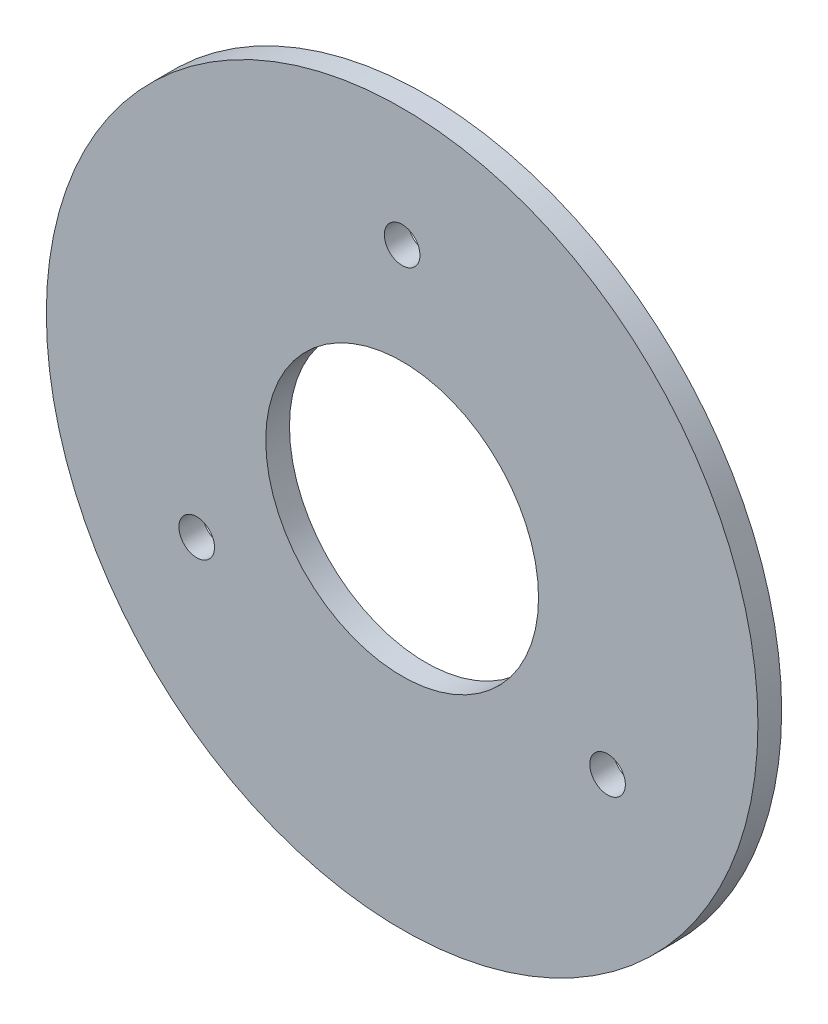
ISO-10303-21;
HEADER;
FILE_DESCRIPTION(('STEP AP214'),'2;1');
FILE_NAME('part.step','',(''),(''),'','','');
FILE_SCHEMA(('AUTOMOTIVE_DESIGN { 1 0 10303 214 1 1 1 1 }'));
ENDSEC;
DATA;
#1=APPLICATION_CONTEXT('core data for automotive mechanical design processes');
#2=APPLICATION_PROTOCOL_DEFINITION('international standard','automotive_design',2000,#1);
#3=PRODUCT_CONTEXT('',#1,'mechanical');
#4=PRODUCT('Part','Part','',(#3));
#5=PRODUCT_RELATED_PRODUCT_CATEGORY('part','',(#4));
#6=PRODUCT_DEFINITION_FORMATION('','',#4);
#7=PRODUCT_DEFINITION_CONTEXT('part definition',#1,'design');
#8=PRODUCT_DEFINITION('design','',#6,#7);
#9=PRODUCT_DEFINITION_SHAPE('','',#8);
#10=(LENGTH_UNIT() NAMED_UNIT(*) SI_UNIT(.MILLI.,.METRE.));
#11=(NAMED_UNIT(*) PLANE_ANGLE_UNIT() SI_UNIT($,.RADIAN.));
#12=(NAMED_UNIT(*) SI_UNIT($,.STERADIAN.) SOLID_ANGLE_UNIT());
#13=UNCERTAINTY_MEASURE_WITH_UNIT(LENGTH_MEASURE(1.E-05),#10,'distance_accuracy_value','');
#14=(GEOMETRIC_REPRESENTATION_CONTEXT(3) GLOBAL_UNCERTAINTY_ASSIGNED_CONTEXT((#13)) GLOBAL_UNIT_ASSIGNED_CONTEXT((#10,
#11,#12)) REPRESENTATION_CONTEXT('',''));
#15=CARTESIAN_POINT('',(0.,0.,0.));
#16=DIRECTION('',(0.,0.,1.));
#17=DIRECTION('',(1.,0.,0.));
#18=AXIS2_PLACEMENT_3D('',#15,#16,#17);
#19=CARTESIAN_POINT('',(0.,0.,2.));
#20=DIRECTION('',(0.,0.,1.));
#21=DIRECTION('',(1.,0.,0.));
#22=AXIS2_PLACEMENT_3D('',#19,#20,#21);
#23=PLANE('',#22);
#24=CARTESIAN_POINT('',(17.3205080756888,-10.,2.));
#25=DIRECTION('',(0.,0.,1.));
#26=DIRECTION('',(1.,0.,0.));
#27=AXIS2_PLACEMENT_3D('',#24,#25,#26);
#28=CIRCLE('',#27,1.5);
#29=CARTESIAN_POINT('',(18.8205080756888,-10.,2.));
#30=VERTEX_POINT('',#29);
#31=EDGE_CURVE('E61',#30,#30,#28,.T.);
#32=ORIENTED_EDGE('',*,*,#31,.F.);
#33=EDGE_LOOP('',(#32));
#34=FACE_BOUND('',#33,.T.);
#35=CARTESIAN_POINT('',(0.,0.,2.));
#36=DIRECTION('',(0.,0.,1.));
#37=DIRECTION('',(1.,0.,0.));
#38=AXIS2_PLACEMENT_3D('',#35,#36,#37);
#39=CIRCLE('',#38,11.5);
#40=CARTESIAN_POINT('',(11.5,0.,2.));
#41=VERTEX_POINT('',#40);
#42=EDGE_CURVE('E49',#41,#41,#39,.T.);
#43=ORIENTED_EDGE('',*,*,#42,.F.);
#44=EDGE_LOOP('',(#43));
#45=FACE_BOUND('',#44,.T.);
#46=CARTESIAN_POINT('',(0.,0.,2.));
#47=DIRECTION('',(0.,0.,1.));
#48=DIRECTION('',(1.,0.,0.));
#49=AXIS2_PLACEMENT_3D('',#46,#47,#48);
#50=CIRCLE('',#49,30.);
#51=CARTESIAN_POINT('',(30.,0.,2.));
#52=VERTEX_POINT('',#51);
#53=EDGE_CURVE('E10',#52,#52,#50,.T.);
#54=ORIENTED_EDGE('',*,*,#53,.T.);
#55=EDGE_LOOP('',(#54));
#56=FACE_BOUND('',#55,.T.);
#57=CARTESIAN_POINT('',(0.,20.,2.));
#58=DIRECTION('',(0.,0.,1.));
#59=DIRECTION('',(1.,0.,0.));
#60=AXIS2_PLACEMENT_3D('',#57,#58,#59);
#61=CIRCLE('',#60,1.5);
#62=CARTESIAN_POINT('',(1.5,20.,2.));
#63=VERTEX_POINT('',#62);
#64=EDGE_CURVE('E54',#63,#63,#61,.T.);
#65=ORIENTED_EDGE('',*,*,#64,.F.);
#66=EDGE_LOOP('',(#65));
#67=FACE_BOUND('',#66,.T.);
#68=CARTESIAN_POINT('',(-17.3205080756888,-10.,2.));
#69=DIRECTION('',(0.,0.,1.));
#70=DIRECTION('',(1.,0.,0.));
#71=AXIS2_PLACEMENT_3D('',#68,#69,#70);
#72=CIRCLE('',#71,1.5);
#73=CARTESIAN_POINT('',(-15.8205080756888,-10.,2.));
#74=VERTEX_POINT('',#73);
#75=EDGE_CURVE('E69',#74,#74,#72,.T.);
#76=ORIENTED_EDGE('',*,*,#75,.F.);
#77=EDGE_LOOP('',(#76));
#78=FACE_BOUND('',#77,.T.);
#79=ADVANCED_FACE('F39',(#34,#45,#56,#67,#78),#23,.T.);
#80=CARTESIAN_POINT('',(0.,0.,0.));
#81=DIRECTION('',(0.,0.,1.));
#82=DIRECTION('',(1.,0.,0.));
#83=AXIS2_PLACEMENT_3D('',#80,#81,#82);
#84=PLANE('',#83);
#85=CARTESIAN_POINT('',(0.,0.,0.));
#86=DIRECTION('',(0.,0.,1.));
#87=DIRECTION('',(1.,0.,0.));
#88=AXIS2_PLACEMENT_3D('',#85,#86,#87);
#89=CIRCLE('',#88,30.);
#90=CARTESIAN_POINT('',(30.,0.,0.));
#91=VERTEX_POINT('',#90);
#92=EDGE_CURVE('E43',#91,#91,#89,.T.);
#93=ORIENTED_EDGE('',*,*,#92,.F.);
#94=EDGE_LOOP('',(#93));
#95=FACE_BOUND('',#94,.T.);
#96=CARTESIAN_POINT('',(0.,0.,0.));
#97=DIRECTION('',(0.,0.,1.));
#98=DIRECTION('',(1.,0.,0.));
#99=AXIS2_PLACEMENT_3D('',#96,#97,#98);
#100=CIRCLE('',#99,11.5);
#101=CARTESIAN_POINT('',(11.5,0.,0.));
#102=VERTEX_POINT('',#101);
#103=EDGE_CURVE('E55',#102,#102,#100,.T.);
#104=ORIENTED_EDGE('',*,*,#103,.T.);
#105=EDGE_LOOP('',(#104));
#106=FACE_BOUND('',#105,.T.);
#107=CARTESIAN_POINT('',(0.,20.,0.));
#108=DIRECTION('',(0.,0.,1.));
#109=DIRECTION('',(1.,0.,0.));
#110=AXIS2_PLACEMENT_3D('',#107,#108,#109);
#111=CIRCLE('',#110,1.5);
#112=CARTESIAN_POINT('',(1.5,20.,0.));
#113=VERTEX_POINT('',#112);
#114=EDGE_CURVE('E59',#113,#113,#111,.T.);
#115=ORIENTED_EDGE('',*,*,#114,.T.);
#116=EDGE_LOOP('',(#115));
#117=FACE_BOUND('',#116,.T.);
#118=CARTESIAN_POINT('',(17.3205080756888,-10.,0.));
#119=DIRECTION('',(0.,0.,1.));
#120=DIRECTION('',(1.,0.,0.));
#121=AXIS2_PLACEMENT_3D('',#118,#119,#120);
#122=CIRCLE('',#121,1.5);
#123=CARTESIAN_POINT('',(18.8205080756888,-10.,0.));
#124=VERTEX_POINT('',#123);
#125=EDGE_CURVE('E63',#124,#124,#122,.T.);
#126=ORIENTED_EDGE('',*,*,#125,.T.);
#127=EDGE_LOOP('',(#126));
#128=FACE_BOUND('',#127,.T.);
#129=CARTESIAN_POINT('',(-17.3205080756888,-10.,0.));
#130=DIRECTION('',(0.,0.,1.));
#131=DIRECTION('',(1.,0.,0.));
#132=AXIS2_PLACEMENT_3D('',#129,#130,#131);
#133=CIRCLE('',#132,1.5);
#134=CARTESIAN_POINT('',(-15.8205080756888,-10.,0.));
#135=VERTEX_POINT('',#134);
#136=EDGE_CURVE('E68',#135,#135,#133,.T.);
#137=ORIENTED_EDGE('',*,*,#136,.T.);
#138=EDGE_LOOP('',(#137));
#139=FACE_BOUND('',#138,.T.);
#140=ADVANCED_FACE('F79',(#95,#106,#117,#128,#139),#84,.F.);
#141=CARTESIAN_POINT('',(0.,0.,2.));
#142=DIRECTION('',(0.,0.,-1.));
#143=DIRECTION('',(-1.,0.,0.));
#144=AXIS2_PLACEMENT_3D('',#141,#142,#143);
#145=CYLINDRICAL_SURFACE('',#144,30.);
#146=ORIENTED_EDGE('',*,*,#53,.F.);
#147=EDGE_LOOP('',(#146));
#148=FACE_BOUND('',#147,.T.);
#149=ORIENTED_EDGE('',*,*,#92,.T.);
#150=EDGE_LOOP('',(#149));
#151=FACE_BOUND('',#150,.T.);
#152=ADVANCED_FACE('F41',(#148,#151),#145,.T.);
#153=CARTESIAN_POINT('',(0.,0.,2.));
#154=DIRECTION('',(0.,0.,-1.));
#155=DIRECTION('',(-1.,0.,0.));
#156=AXIS2_PLACEMENT_3D('',#153,#154,#155);
#157=CYLINDRICAL_SURFACE('',#156,11.5);
#158=ORIENTED_EDGE('',*,*,#42,.T.);
#159=EDGE_LOOP('',(#158));
#160=FACE_BOUND('',#159,.T.);
#161=ORIENTED_EDGE('',*,*,#103,.F.);
#162=EDGE_LOOP('',(#161));
#163=FACE_BOUND('',#162,.T.);
#164=ADVANCED_FACE('F89',(#160,#163),#157,.F.);
#165=CARTESIAN_POINT('',(0.,20.,2.));
#166=DIRECTION('',(0.,0.,-1.));
#167=DIRECTION('',(-1.,0.,0.));
#168=AXIS2_PLACEMENT_3D('',#165,#166,#167);
#169=CYLINDRICAL_SURFACE('',#168,1.5);
#170=ORIENTED_EDGE('',*,*,#64,.T.);
#171=EDGE_LOOP('',(#170));
#172=FACE_BOUND('',#171,.T.);
#173=ORIENTED_EDGE('',*,*,#114,.F.);
#174=EDGE_LOOP('',(#173));
#175=FACE_BOUND('',#174,.T.);
#176=ADVANCED_FACE('F91',(#172,#175),#169,.F.);
#177=CARTESIAN_POINT('',(17.3205080756888,-10.,2.));
#178=DIRECTION('',(0.,0.,-1.));
#179=DIRECTION('',(-1.,0.,0.));
#180=AXIS2_PLACEMENT_3D('',#177,#178,#179);
#181=CYLINDRICAL_SURFACE('',#180,1.5);
#182=ORIENTED_EDGE('',*,*,#31,.T.);
#183=EDGE_LOOP('',(#182));
#184=FACE_BOUND('',#183,.T.);
#185=ORIENTED_EDGE('',*,*,#125,.F.);
#186=EDGE_LOOP('',(#185));
#187=FACE_BOUND('',#186,.T.);
#188=ADVANCED_FACE('F100',(#184,#187),#181,.F.);
#189=CARTESIAN_POINT('',(-17.3205080756888,-10.,2.));
#190=DIRECTION('',(0.,0.,-1.));
#191=DIRECTION('',(-1.,0.,0.));
#192=AXIS2_PLACEMENT_3D('',#189,#190,#191);
#193=CYLINDRICAL_SURFACE('',#192,1.5);
#194=ORIENTED_EDGE('',*,*,#75,.T.);
#195=EDGE_LOOP('',(#194));
#196=FACE_BOUND('',#195,.T.);
#197=ORIENTED_EDGE('',*,*,#136,.F.);
#198=EDGE_LOOP('',(#197));
#199=FACE_BOUND('',#198,.T.);
#200=ADVANCED_FACE('F76',(#196,#199),#193,.F.);
#201=CLOSED_SHELL('',(#79,#140,#152,#164,#176,#188,#200));
#202=MANIFOLD_SOLID_BREP('B2',#201);
#203=ADVANCED_BREP_SHAPE_REPRESENTATION('',(#18,#202),#14);
#204=SHAPE_DEFINITION_REPRESENTATION(#9,#203);
ENDSEC;
END-ISO-10303-21;
